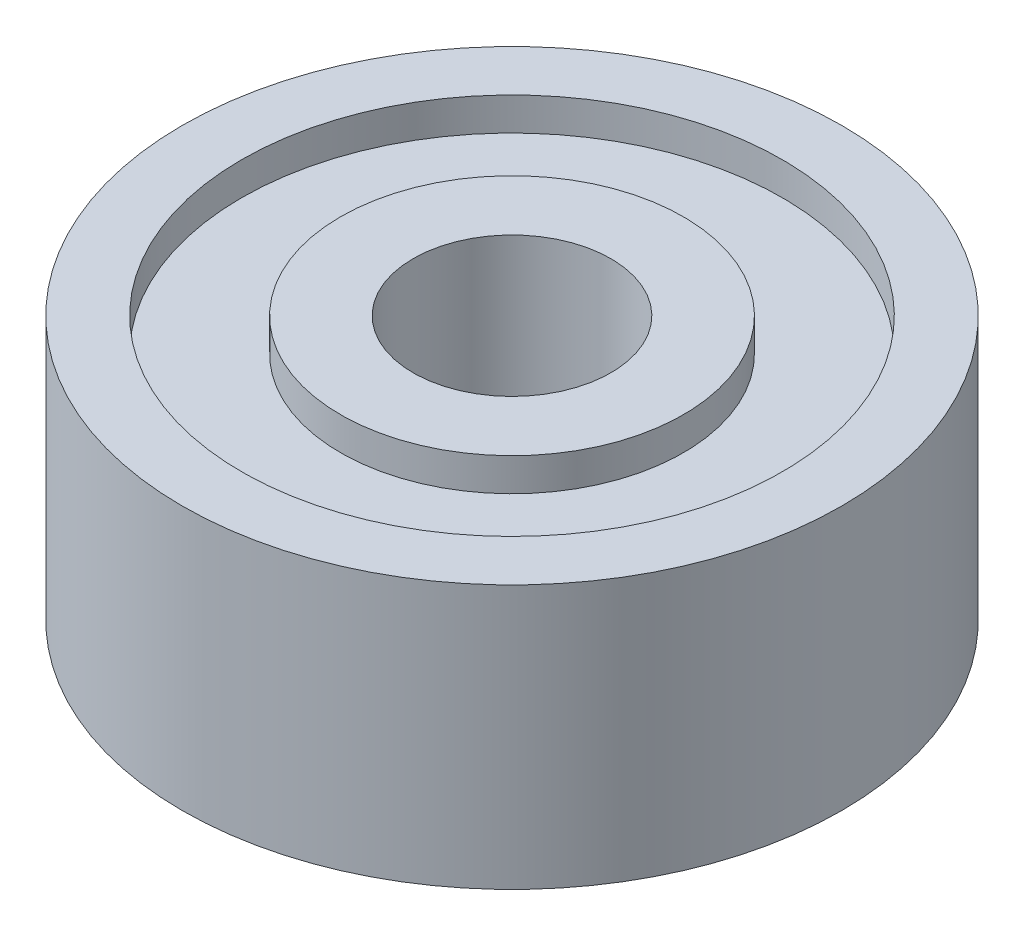
ISO-10303-21;
HEADER;
FILE_DESCRIPTION(('STEP AP214'),'2;1');
FILE_NAME('part.step','',(''),(''),'','','');
FILE_SCHEMA(('AUTOMOTIVE_DESIGN { 1 0 10303 214 1 1 1 1 }'));
ENDSEC;
DATA;
#1=APPLICATION_CONTEXT('core data for automotive mechanical design processes');
#2=APPLICATION_PROTOCOL_DEFINITION('international standard','automotive_design',2000,#1);
#3=PRODUCT_CONTEXT('',#1,'mechanical');
#4=PRODUCT('Part','Part','',(#3));
#5=PRODUCT_RELATED_PRODUCT_CATEGORY('part','',(#4));
#6=PRODUCT_DEFINITION_FORMATION('','',#4);
#7=PRODUCT_DEFINITION_CONTEXT('part definition',#1,'design');
#8=PRODUCT_DEFINITION('design','',#6,#7);
#9=PRODUCT_DEFINITION_SHAPE('','',#8);
#10=(LENGTH_UNIT() NAMED_UNIT(*) SI_UNIT(.MILLI.,.METRE.));
#11=(NAMED_UNIT(*) PLANE_ANGLE_UNIT() SI_UNIT($,.RADIAN.));
#12=(NAMED_UNIT(*) SI_UNIT($,.STERADIAN.) SOLID_ANGLE_UNIT());
#13=UNCERTAINTY_MEASURE_WITH_UNIT(LENGTH_MEASURE(1.E-05),#10,'distance_accuracy_value','');
#14=(GEOMETRIC_REPRESENTATION_CONTEXT(3) GLOBAL_UNCERTAINTY_ASSIGNED_CONTEXT((#13)) GLOBAL_UNIT_ASSIGNED_CONTEXT((#10,
#11,#12)) REPRESENTATION_CONTEXT('',''));
#15=CARTESIAN_POINT('',(0.,0.,0.));
#16=DIRECTION('',(0.,0.,1.));
#17=DIRECTION('',(1.,0.,0.));
#18=AXIS2_PLACEMENT_3D('',#15,#16,#17);
#19=CARTESIAN_POINT('',(0.,1.99999999999985,0.));
#20=DIRECTION('',(0.,1.,0.));
#21=DIRECTION('',(-1.,0.,0.));
#22=AXIS2_PLACEMENT_3D('',#19,#20,#21);
#23=CYLINDRICAL_SURFACE('',#22,1.5);
#24=CARTESIAN_POINT('',(0.,0.,0.));
#25=DIRECTION('',(0.,1.,0.));
#26=DIRECTION('',(-1.,0.,0.));
#27=AXIS2_PLACEMENT_3D('',#24,#25,#26);
#28=CIRCLE('',#27,1.5);
#29=CARTESIAN_POINT('',(-1.50000000000002,0.,0.));
#30=VERTEX_POINT('',#29);
#31=EDGE_CURVE('E17',#30,#30,#28,.T.);
#32=ORIENTED_EDGE('',*,*,#31,.F.);
#33=EDGE_LOOP('',(#32));
#34=FACE_BOUND('',#33,.T.);
#35=CARTESIAN_POINT('',(0.,3.99999999999971,0.));
#36=DIRECTION('',(0.,1.,0.));
#37=DIRECTION('',(-1.,0.,0.));
#38=AXIS2_PLACEMENT_3D('',#35,#36,#37);
#39=CIRCLE('',#38,1.5);
#40=CARTESIAN_POINT('',(-1.50000000000002,3.99999999999971,0.));
#41=VERTEX_POINT('',#40);
#42=EDGE_CURVE('E62',#41,#41,#39,.F.);
#43=ORIENTED_EDGE('',*,*,#42,.F.);
#44=EDGE_LOOP('',(#43));
#45=FACE_BOUND('',#44,.T.);
#46=ADVANCED_FACE('F14',(#34,#45),#23,.F.);
#47=CARTESIAN_POINT('',(-2.6,0.,0.));
#48=DIRECTION('',(0.,-1.,0.));
#49=DIRECTION('',(1.,0.,0.));
#50=AXIS2_PLACEMENT_3D('',#47,#48,#49);
#51=PLANE('',#50);
#52=ORIENTED_EDGE('',*,*,#31,.T.);
#53=EDGE_LOOP('',(#52));
#54=FACE_BOUND('',#53,.T.);
#55=CARTESIAN_POINT('',(0.,0.,0.));
#56=DIRECTION('',(0.,1.,0.));
#57=DIRECTION('',(-1.,0.,0.));
#58=AXIS2_PLACEMENT_3D('',#55,#56,#57);
#59=CIRCLE('',#58,2.6);
#60=CARTESIAN_POINT('',(-2.6,0.,0.));
#61=VERTEX_POINT('',#60);
#62=EDGE_CURVE('E59',#61,#61,#59,.T.);
#63=ORIENTED_EDGE('',*,*,#62,.F.);
#64=EDGE_LOOP('',(#63));
#65=FACE_BOUND('',#64,.T.);
#66=ADVANCED_FACE('F71',(#54,#65),#51,.T.);
#67=CARTESIAN_POINT('',(-1.49999999999999,3.99999999999974,0.));
#68=DIRECTION('',(0.,1.,0.));
#69=DIRECTION('',(-1.,0.,0.));
#70=AXIS2_PLACEMENT_3D('',#67,#68,#69);
#71=PLANE('',#70);
#72=ORIENTED_EDGE('',*,*,#42,.T.);
#73=EDGE_LOOP('',(#72));
#74=FACE_BOUND('',#73,.T.);
#75=CARTESIAN_POINT('',(0.,3.99999999999973,0.));
#76=DIRECTION('',(0.,1.,0.));
#77=DIRECTION('',(-1.,0.,0.));
#78=AXIS2_PLACEMENT_3D('',#75,#76,#77);
#79=CIRCLE('',#78,2.6);
#80=CARTESIAN_POINT('',(-2.59999999999999,3.99999999999973,0.));
#81=VERTEX_POINT('',#80);
#82=EDGE_CURVE('E55',#81,#81,#79,.F.);
#83=ORIENTED_EDGE('',*,*,#82,.F.);
#84=EDGE_LOOP('',(#83));
#85=FACE_BOUND('',#84,.T.);
#86=ADVANCED_FACE('F80',(#74,#85),#71,.T.);
#87=CARTESIAN_POINT('',(0.,0.25,0.));
#88=DIRECTION('',(0.,1.,0.));
#89=DIRECTION('',(-1.,0.,0.));
#90=AXIS2_PLACEMENT_3D('',#87,#88,#89);
#91=CYLINDRICAL_SURFACE('',#90,2.6);
#92=ORIENTED_EDGE('',*,*,#62,.T.);
#93=EDGE_LOOP('',(#92));
#94=FACE_BOUND('',#93,.T.);
#95=CARTESIAN_POINT('',(0.,0.5,0.));
#96=DIRECTION('',(0.,1.,0.));
#97=DIRECTION('',(-1.,0.,0.));
#98=AXIS2_PLACEMENT_3D('',#95,#96,#97);
#99=CIRCLE('',#98,2.6);
#100=CARTESIAN_POINT('',(-2.6,0.5,0.));
#101=VERTEX_POINT('',#100);
#102=EDGE_CURVE('E51',#101,#101,#99,.T.);
#103=ORIENTED_EDGE('',*,*,#102,.F.);
#104=EDGE_LOOP('',(#103));
#105=FACE_BOUND('',#104,.T.);
#106=ADVANCED_FACE('F115',(#94,#105),#91,.T.);
#107=CARTESIAN_POINT('',(0.,3.74999999999967,0.));
#108=DIRECTION('',(0.,1.,0.));
#109=DIRECTION('',(-1.,0.,0.));
#110=AXIS2_PLACEMENT_3D('',#107,#108,#109);
#111=CYLINDRICAL_SURFACE('',#110,2.6);
#112=ORIENTED_EDGE('',*,*,#82,.T.);
#113=EDGE_LOOP('',(#112));
#114=FACE_BOUND('',#113,.T.);
#115=CARTESIAN_POINT('',(0.,3.49999999999963,0.));
#116=DIRECTION('',(0.,1.,0.));
#117=DIRECTION('',(-1.,0.,0.));
#118=AXIS2_PLACEMENT_3D('',#115,#116,#117);
#119=CIRCLE('',#118,2.6);
#120=CARTESIAN_POINT('',(-2.59999999999999,3.49999999999963,0.));
#121=VERTEX_POINT('',#120);
#122=EDGE_CURVE('E47',#121,#121,#119,.F.);
#123=ORIENTED_EDGE('',*,*,#122,.F.);
#124=EDGE_LOOP('',(#123));
#125=FACE_BOUND('',#124,.T.);
#126=ADVANCED_FACE('F111',(#114,#125),#111,.T.);
#127=CARTESIAN_POINT('',(-4.1,0.500000000000005,0.));
#128=DIRECTION('',(0.,-1.,0.));
#129=DIRECTION('',(1.,0.,0.));
#130=AXIS2_PLACEMENT_3D('',#127,#128,#129);
#131=PLANE('',#130);
#132=ORIENTED_EDGE('',*,*,#102,.T.);
#133=EDGE_LOOP('',(#132));
#134=FACE_BOUND('',#133,.T.);
#135=CARTESIAN_POINT('',(0.,0.499999999999987,0.));
#136=DIRECTION('',(0.,1.,0.));
#137=DIRECTION('',(-1.,0.,0.));
#138=AXIS2_PLACEMENT_3D('',#135,#136,#137);
#139=CIRCLE('',#138,4.10000000000001);
#140=CARTESIAN_POINT('',(-4.10000000000001,0.499999999999987,0.));
#141=VERTEX_POINT('',#140);
#142=EDGE_CURVE('E44',#141,#141,#139,.F.);
#143=ORIENTED_EDGE('',*,*,#142,.T.);
#144=EDGE_LOOP('',(#143));
#145=FACE_BOUND('',#144,.T.);
#146=ADVANCED_FACE('F107',(#134,#145),#131,.T.);
#147=CARTESIAN_POINT('',(-2.6,3.49999999999966,0.));
#148=DIRECTION('',(0.,1.,0.));
#149=DIRECTION('',(-1.,0.,0.));
#150=AXIS2_PLACEMENT_3D('',#147,#148,#149);
#151=PLANE('',#150);
#152=ORIENTED_EDGE('',*,*,#122,.T.);
#153=EDGE_LOOP('',(#152));
#154=FACE_BOUND('',#153,.T.);
#155=CARTESIAN_POINT('',(0.,3.5,0.));
#156=DIRECTION('',(0.,1.,0.));
#157=DIRECTION('',(-1.,0.,0.));
#158=AXIS2_PLACEMENT_3D('',#155,#156,#157);
#159=CIRCLE('',#158,4.10000000000001);
#160=CARTESIAN_POINT('',(-4.1,3.5,0.));
#161=VERTEX_POINT('',#160);
#162=EDGE_CURVE('E40',#161,#161,#159,.T.);
#163=ORIENTED_EDGE('',*,*,#162,.T.);
#164=EDGE_LOOP('',(#163));
#165=FACE_BOUND('',#164,.T.);
#166=ADVANCED_FACE('F103',(#154,#165),#151,.T.);
#167=CARTESIAN_POINT('',(0.,0.249999999999986,0.));
#168=DIRECTION('',(0.,1.,0.));
#169=DIRECTION('',(-1.,0.,0.));
#170=AXIS2_PLACEMENT_3D('',#167,#168,#169);
#171=CYLINDRICAL_SURFACE('',#170,4.10000000000001);
#172=ORIENTED_EDGE('',*,*,#142,.F.);
#173=EDGE_LOOP('',(#172));
#174=FACE_BOUND('',#173,.T.);
#175=CARTESIAN_POINT('',(0.,0.,0.));
#176=DIRECTION('',(0.,1.,0.));
#177=DIRECTION('',(-1.,0.,0.));
#178=AXIS2_PLACEMENT_3D('',#175,#176,#177);
#179=CIRCLE('',#178,4.10000000000001);
#180=CARTESIAN_POINT('',(-4.10000000000001,0.,0.));
#181=VERTEX_POINT('',#180);
#182=EDGE_CURVE('E36',#181,#181,#179,.T.);
#183=ORIENTED_EDGE('',*,*,#182,.F.);
#184=EDGE_LOOP('',(#183));
#185=FACE_BOUND('',#184,.T.);
#186=ADVANCED_FACE('F99',(#174,#185),#171,.F.);
#187=CARTESIAN_POINT('',(0.,3.75,0.));
#188=DIRECTION('',(0.,1.,0.));
#189=DIRECTION('',(-1.,0.,0.));
#190=AXIS2_PLACEMENT_3D('',#187,#188,#189);
#191=CYLINDRICAL_SURFACE('',#190,4.10000000000001);
#192=ORIENTED_EDGE('',*,*,#162,.F.);
#193=EDGE_LOOP('',(#192));
#194=FACE_BOUND('',#193,.T.);
#195=CARTESIAN_POINT('',(0.,4.,0.));
#196=DIRECTION('',(0.,1.,0.));
#197=DIRECTION('',(-1.,0.,0.));
#198=AXIS2_PLACEMENT_3D('',#195,#196,#197);
#199=CIRCLE('',#198,4.10000000000001);
#200=CARTESIAN_POINT('',(-4.1,4.,0.));
#201=VERTEX_POINT('',#200);
#202=EDGE_CURVE('E31',#201,#201,#199,.F.);
#203=ORIENTED_EDGE('',*,*,#202,.F.);
#204=EDGE_LOOP('',(#203));
#205=FACE_BOUND('',#204,.T.);
#206=ADVANCED_FACE('F95',(#194,#205),#191,.F.);
#207=CARTESIAN_POINT('',(-5.,-2.8796409701215E-13,0.));
#208=DIRECTION('',(0.,-1.,0.));
#209=DIRECTION('',(1.,0.,0.));
#210=AXIS2_PLACEMENT_3D('',#207,#208,#209);
#211=PLANE('',#210);
#212=ORIENTED_EDGE('',*,*,#182,.T.);
#213=EDGE_LOOP('',(#212));
#214=FACE_BOUND('',#213,.T.);
#215=CARTESIAN_POINT('',(0.,-2.91433543964104E-13,0.));
#216=DIRECTION('',(0.,1.,0.));
#217=DIRECTION('',(-1.,0.,0.));
#218=AXIS2_PLACEMENT_3D('',#215,#216,#217);
#219=CIRCLE('',#218,5.00000000000001);
#220=CARTESIAN_POINT('',(-5.00000000000002,-2.91433543964104E-13,0.));
#221=VERTEX_POINT('',#220);
#222=EDGE_CURVE('E22',#221,#221,#219,.T.);
#223=ORIENTED_EDGE('',*,*,#222,.F.);
#224=EDGE_LOOP('',(#223));
#225=FACE_BOUND('',#224,.T.);
#226=ADVANCED_FACE('F88',(#214,#225),#211,.T.);
#227=CARTESIAN_POINT('',(-4.1,4.00000000000002,0.));
#228=DIRECTION('',(0.,1.,0.));
#229=DIRECTION('',(-1.,0.,0.));
#230=AXIS2_PLACEMENT_3D('',#227,#228,#229);
#231=PLANE('',#230);
#232=ORIENTED_EDGE('',*,*,#202,.T.);
#233=EDGE_LOOP('',(#232));
#234=FACE_BOUND('',#233,.T.);
#235=CARTESIAN_POINT('',(0.,3.99999999999971,0.));
#236=DIRECTION('',(0.,1.,0.));
#237=DIRECTION('',(-1.,0.,0.));
#238=AXIS2_PLACEMENT_3D('',#235,#236,#237);
#239=CIRCLE('',#238,5.00000000000001);
#240=CARTESIAN_POINT('',(-5.00000000000002,3.99999999999971,0.));
#241=VERTEX_POINT('',#240);
#242=EDGE_CURVE('E10',#241,#241,#239,.F.);
#243=ORIENTED_EDGE('',*,*,#242,.F.);
#244=EDGE_LOOP('',(#243));
#245=FACE_BOUND('',#244,.T.);
#246=ADVANCED_FACE('F83',(#234,#245),#231,.T.);
#247=CARTESIAN_POINT('',(0.,1.99999999999971,0.));
#248=DIRECTION('',(0.,1.,0.));
#249=DIRECTION('',(-1.,0.,0.));
#250=AXIS2_PLACEMENT_3D('',#247,#248,#249);
#251=CYLINDRICAL_SURFACE('',#250,5.00000000000001);
#252=ORIENTED_EDGE('',*,*,#242,.T.);
#253=EDGE_LOOP('',(#252));
#254=FACE_BOUND('',#253,.T.);
#255=ORIENTED_EDGE('',*,*,#222,.T.);
#256=EDGE_LOOP('',(#255));
#257=FACE_BOUND('',#256,.T.);
#258=ADVANCED_FACE('F81',(#254,#257),#251,.T.);
#259=CLOSED_SHELL('',(#46,#66,#86,#106,#126,#146,#166,#186,#206,#226,#246,#258));
#260=MANIFOLD_SOLID_BREP('B1',#259);
#261=ADVANCED_BREP_SHAPE_REPRESENTATION('',(#18,#260),#14);
#262=SHAPE_DEFINITION_REPRESENTATION(#9,#261);
ENDSEC;
END-ISO-10303-21;
